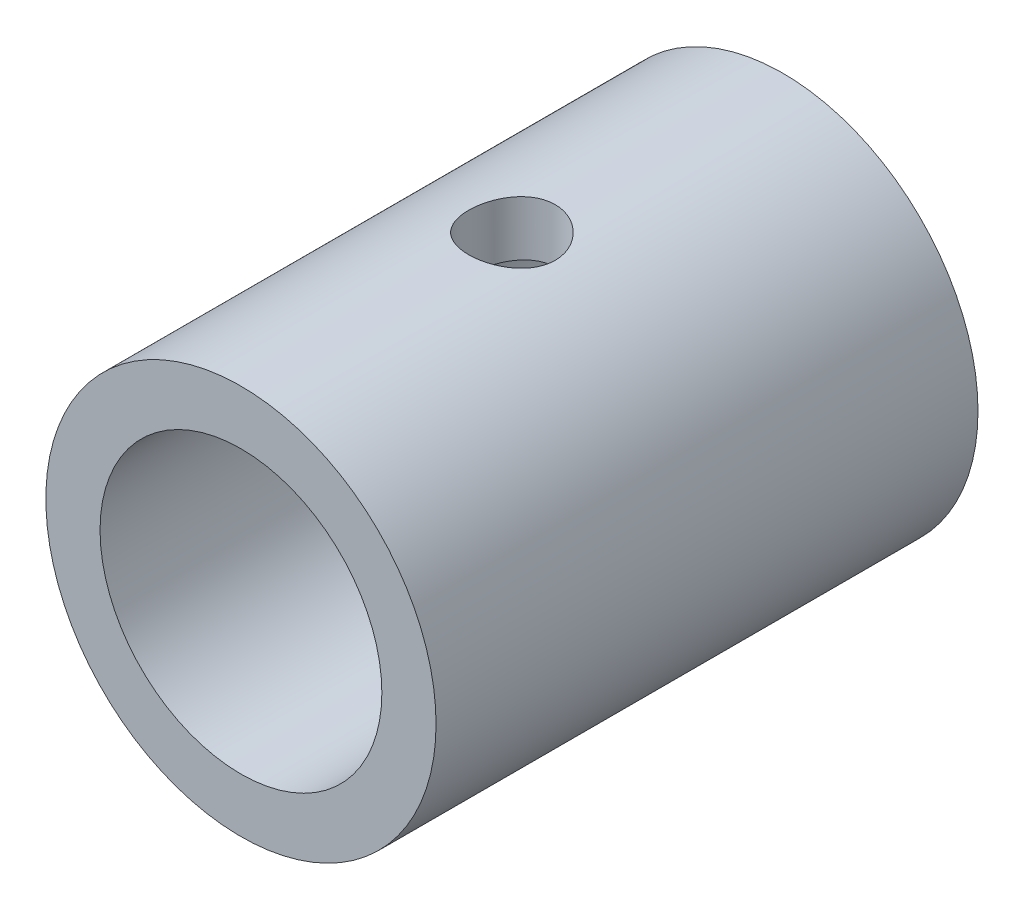
ISO-10303-21;
HEADER;
FILE_DESCRIPTION(('STEP AP214'),'2;1');
FILE_NAME('part.step','',(''),(''),'','','');
FILE_SCHEMA(('AUTOMOTIVE_DESIGN { 1 0 10303 214 1 1 1 1 }'));
ENDSEC;
DATA;
#1=APPLICATION_CONTEXT('core data for automotive mechanical design processes');
#2=APPLICATION_PROTOCOL_DEFINITION('international standard','automotive_design',2000,#1);
#3=PRODUCT_CONTEXT('',#1,'mechanical');
#4=PRODUCT('Part','Part','',(#3));
#5=PRODUCT_RELATED_PRODUCT_CATEGORY('part','',(#4));
#6=PRODUCT_DEFINITION_FORMATION('','',#4);
#7=PRODUCT_DEFINITION_CONTEXT('part definition',#1,'design');
#8=PRODUCT_DEFINITION('design','',#6,#7);
#9=PRODUCT_DEFINITION_SHAPE('','',#8);
#10=(LENGTH_UNIT() NAMED_UNIT(*) SI_UNIT(.MILLI.,.METRE.));
#11=(NAMED_UNIT(*) PLANE_ANGLE_UNIT() SI_UNIT($,.RADIAN.));
#12=(NAMED_UNIT(*) SI_UNIT($,.STERADIAN.) SOLID_ANGLE_UNIT());
#13=UNCERTAINTY_MEASURE_WITH_UNIT(LENGTH_MEASURE(1.E-05),#10,'distance_accuracy_value','');
#14=(GEOMETRIC_REPRESENTATION_CONTEXT(3) GLOBAL_UNCERTAINTY_ASSIGNED_CONTEXT((#13)) GLOBAL_UNIT_ASSIGNED_CONTEXT((#10,
#11,#12)) REPRESENTATION_CONTEXT('',''));
#15=CARTESIAN_POINT('',(0.,0.,0.));
#16=DIRECTION('',(0.,0.,1.));
#17=DIRECTION('',(1.,0.,0.));
#18=AXIS2_PLACEMENT_3D('',#15,#16,#17);
#19=CARTESIAN_POINT('',(0.,0.,12.5));
#20=DIRECTION('',(0.,0.,-1.));
#21=DIRECTION('',(-1.,0.,0.));
#22=AXIS2_PLACEMENT_3D('',#19,#20,#21);
#23=CYLINDRICAL_SURFACE('',#22,6.5);
#24=CARTESIAN_POINT('',(0.,0.,-12.5));
#25=DIRECTION('',(0.,0.,1.));
#26=DIRECTION('',(1.,0.,0.));
#27=AXIS2_PLACEMENT_3D('',#24,#25,#26);
#28=CIRCLE('',#27,6.5);
#29=CARTESIAN_POINT('',(6.5,0.,-12.5));
#30=VERTEX_POINT('',#29);
#31=EDGE_CURVE('E60',#30,#30,#28,.T.);
#32=ORIENTED_EDGE('',*,*,#31,.F.);
#33=EDGE_LOOP('',(#32));
#34=FACE_BOUND('',#33,.T.);
#35=CARTESIAN_POINT('',(0.,0.,12.5));
#36=DIRECTION('',(0.,0.,1.));
#37=DIRECTION('',(1.,0.,0.));
#38=AXIS2_PLACEMENT_3D('',#35,#36,#37);
#39=CIRCLE('',#38,6.5);
#40=CARTESIAN_POINT('',(6.5,0.,12.5));
#41=VERTEX_POINT('',#40);
#42=EDGE_CURVE('E51',#41,#41,#39,.T.);
#43=ORIENTED_EDGE('',*,*,#42,.T.);
#44=EDGE_LOOP('',(#43));
#45=FACE_BOUND('',#44,.T.);
#46=CARTESIAN_POINT('',(0.,6.5,-2.));
#47=CARTESIAN_POINT('',(-0.10958647155408,6.49999929187436,-1.99999903907904));
#48=CARTESIAN_POINT('',(-0.219182761349475,6.49720235792931,-1.99096335239673));
#49=CARTESIAN_POINT('',(-0.435175528984373,6.48631855265072,-1.95515058806477));
#50=CARTESIAN_POINT('',(-0.541571186300281,6.47823033671536,-1.92836900086749));
#51=CARTESIAN_POINT('',(-0.748016546984701,6.45764858487676,-1.85804929310721));
#52=CARTESIAN_POINT('',(-0.848075627090343,6.44516174661238,-1.81453663922322));
#53=CARTESIAN_POINT('',(-1.03947745536717,6.41707535917941,-1.71209679263276));
#54=CARTESIAN_POINT('',(-1.13081890919355,6.40147534884382,-1.65316731576617));
#55=CARTESIAN_POINT('',(-1.30493699247679,6.36829752406617,-1.51970232456005));
#56=CARTESIAN_POINT('',(-1.38741488565838,6.35067760587489,-1.44478758075688));
#57=CARTESIAN_POINT('',(-1.53885708269872,6.31569252815343,-1.28228637649204));
#58=CARTESIAN_POINT('',(-1.60781896662595,6.29832741475793,-1.19469765172807));
#59=CARTESIAN_POINT('',(-1.73187276184925,6.2653687784566,-1.00677139557264));
#60=CARTESIAN_POINT('',(-1.78659481361997,6.24982736044083,-0.906179710702226));
#61=CARTESIAN_POINT('',(-1.8782224418158,6.22290748386974,-0.696666036262746));
#62=CARTESIAN_POINT('',(-1.91513254914664,6.21152796681115,-0.58774617334561));
#63=CARTESIAN_POINT('',(-1.96900160513188,6.19466009001292,-0.36803269394755));
#64=CARTESIAN_POINT('',(-1.9865133955599,6.18900890037713,-0.257387466392708));
#65=CARTESIAN_POINT('',(-2.00281555895419,6.1837537050085,-0.0345962594275914));
#66=CARTESIAN_POINT('',(-2.00161073572821,6.18414814760279,0.077549327517495));
#67=CARTESIAN_POINT('',(-1.98094698228321,6.19079569362891,0.2956150705989));
#68=CARTESIAN_POINT('',(-1.96218684702854,6.19682450731138,0.401609425322224));
#69=CARTESIAN_POINT('',(-1.90807645250928,6.21369772255051,0.608866696596906));
#70=CARTESIAN_POINT('',(-1.87272447914839,6.22454262164885,0.710129123105842));
#71=CARTESIAN_POINT('',(-1.785932217008,6.25000070721951,0.906730047845012));
#72=CARTESIAN_POINT('',(-1.73426970827151,6.2646654217354,1.00196348562844));
#73=CARTESIAN_POINT('',(-1.61647725848254,6.29608673576222,1.18264054437169));
#74=CARTESIAN_POINT('',(-1.55034365635742,6.31284386417593,1.26808167960593));
#75=CARTESIAN_POINT('',(-1.40204114131455,6.34746551983527,1.43070438833206));
#76=CARTESIAN_POINT('',(-1.31929416295853,6.36534631113152,1.50735628256663));
#77=CARTESIAN_POINT('',(-1.14189770882472,6.39954830533242,1.64582220434313));
#78=CARTESIAN_POINT('',(-1.04724740490765,6.4158693995865,1.7076351986405));
#79=CARTESIAN_POINT('',(-0.847732923697558,6.44527556867774,1.8150129771275));
#80=CARTESIAN_POINT('',(-0.742798718966909,6.45833594999018,1.86045486403883));
#81=CARTESIAN_POINT('',(-0.526280934909782,6.47957102319473,1.93288625395853));
#82=CARTESIAN_POINT('',(-0.414699321015766,6.48774715140185,1.95988118201066));
#83=CARTESIAN_POINT('',(-0.192552832432243,6.49806290071844,1.99375804657509));
#84=CARTESIAN_POINT('',(-0.0821071867281238,6.50041772114305,2.0013573525657));
#85=CARTESIAN_POINT('',(0.138491178007733,6.49946000316609,1.99824523351199));
#86=CARTESIAN_POINT('',(0.248643936188298,6.49614826472318,1.98753639306293));
#87=CARTESIAN_POINT('',(0.46278580145148,6.48437074848215,1.94868951788977));
#88=CARTESIAN_POINT('',(0.566859358780056,6.47603039774079,1.92097535283384));
#89=CARTESIAN_POINT('',(0.768852811369361,6.45516726536364,1.8494189235729));
#90=CARTESIAN_POINT('',(0.866771952253669,6.44264397218779,1.80557468672391));
#91=CARTESIAN_POINT('',(1.05627961444668,6.41433382910965,1.70182880519005));
#92=CARTESIAN_POINT('',(1.14766081519562,6.39847611273322,1.64156832323482));
#93=CARTESIAN_POINT('',(1.31925606832413,6.36531333623025,1.50713316991917));
#94=CARTESIAN_POINT('',(1.39946717074091,6.34800789569184,1.43295483502397));
#95=CARTESIAN_POINT('',(1.54963528009096,6.31306645909658,1.26941670055103));
#96=CARTESIAN_POINT('',(1.61908131008095,6.29544322340724,1.17958392405072));
#97=CARTESIAN_POINT('',(1.74195487773042,6.26255963317191,0.989156665398131));
#98=CARTESIAN_POINT('',(1.79538273895787,6.24729923089955,0.888562400684256));
#99=CARTESIAN_POINT('',(1.88435707765313,6.22104126828921,0.679721743070963));
#100=CARTESIAN_POINT('',(1.9199786710239,6.21002584634022,0.571509730226962));
#101=CARTESIAN_POINT('',(1.97237526121825,6.19358575896332,0.350217384273935));
#102=CARTESIAN_POINT('',(1.98915714872108,6.18815904950702,0.237138846833982));
#103=CARTESIAN_POINT('',(2.00291323790433,6.18371932373484,0.0146519278920736));
#104=CARTESIAN_POINT('',(2.00072360720728,6.18443554393433,-0.094700004551062));
#105=CARTESIAN_POINT('',(1.97860856561739,6.19154584982148,-0.311397838847259));
#106=CARTESIAN_POINT('',(1.95868393542585,6.19793968557834,-0.418743828790289));
#107=CARTESIAN_POINT('',(1.90221657867545,6.21549850608435,-0.626937428537499));
#108=CARTESIAN_POINT('',(1.8659061649831,6.22659666514378,-0.727854105684839));
#109=CARTESIAN_POINT('',(1.77788001247773,6.25229841004041,-0.92224355662551));
#110=CARTESIAN_POINT('',(1.72616121006624,6.26690269287625,-1.01571484538877));
#111=CARTESIAN_POINT('',(1.60648172875982,6.29866516433667,-1.19641250748051));
#112=CARTESIAN_POINT('',(1.5379775201733,6.31589943241281,-1.28326549413256));
#113=CARTESIAN_POINT('',(1.38763671757875,6.35062263668655,-1.44451406697947));
#114=CARTESIAN_POINT('',(1.30579660000223,6.36811163907406,-1.51890635028652));
#115=CARTESIAN_POINT('',(1.12802317077525,6.40203042414332,-1.65544917959683));
#116=CARTESIAN_POINT('',(1.0317288656853,6.41840990638034,-1.71714357533484));
#117=CARTESIAN_POINT('',(0.829631192009797,6.44764383058531,-1.82338445665249));
#118=CARTESIAN_POINT('',(0.7238318640324,6.46049976109691,-1.86793818662102));
#119=CARTESIAN_POINT('',(0.515929652571417,6.48025348346413,-1.93510071206019));
#120=CARTESIAN_POINT('',(0.414403258515525,6.48759534805451,-1.95936947108914));
#121=CARTESIAN_POINT('',(0.208587191828517,6.4974684909107,-1.99181805932323));
#122=CARTESIAN_POINT('',(0.104298042658334,6.50000067395288,-2.00000091454879));
#123=CARTESIAN_POINT('',(0.,6.5,-2.));
#124=B_SPLINE_CURVE_WITH_KNOTS('',3,(#46,#47,#48,#49,#50,#51,#52,#53,#54,#55,#56,#57,#58,#59,
#60,#61,#62,#63,#64,#65,#66,#67,#68,#69,#70,#71,#72,#73,#74,#75,#76,#77,#78,#79,#80,#81,#82,#83,
#84,#85,#86,#87,#88,#89,#90,#91,#92,#93,#94,#95,#96,#97,#98,#99,#100,#101,#102,#103,#104,#105,
#106,#107,#108,#109,#110,#111,#112,#113,#114,#115,#116,#117,#118,#119,#120,#121,#122,#123),
.UNSPECIFIED.,.T.,.F.,(4,2,2,2,2,2,2,2,2,2,2,2,2,2,2,2,2,2,2,2,2,2,2,2,2,2,2,2,2,2,2,2,2,2,2,2,
2,2,4),(0.,0.328376148353204,0.656835774920463,0.984797413319644,1.31280767013794,
1.64969601962051,1.98664463123191,2.33162619975385,2.67651996741947,3.0113091274622,
3.34601236190892,3.66793485951994,3.98989062214147,4.31643724588171,4.64306657905952,
4.98408507994297,5.32512731933627,5.66867887562647,6.01212935372403,6.34267966649236,
6.67318331870836,6.99576592200042,7.31838798898982,7.6487232534981,7.97914559299321,
8.322234878021,8.66531723215741,9.00693981167225,9.34843740094787,9.67496275718919,
10.0014737403731,10.3234943027839,10.6455789342452,10.9799294848454,11.3143685200785,
11.6592775258489,12.0040405975475,12.3166287634493,12.6291581207982),.UNSPECIFIED.);
#125=CARTESIAN_POINT('',(0.,6.5,-2.));
#126=VERTEX_POINT('',#125);
#127=EDGE_CURVE('E62',#126,#126,#124,.T.);
#128=ORIENTED_EDGE('',*,*,#127,.T.);
#129=EDGE_LOOP('',(#128));
#130=FACE_BOUND('',#129,.T.);
#131=ADVANCED_FACE('F36',(#34,#45,#130),#23,.F.);
#132=CARTESIAN_POINT('',(0.,0.,12.5));
#133=DIRECTION('',(0.,0.,-1.));
#134=DIRECTION('',(-1.,0.,0.));
#135=AXIS2_PLACEMENT_3D('',#132,#133,#134);
#136=CYLINDRICAL_SURFACE('',#135,9.);
#137=CARTESIAN_POINT('',(0.,0.,12.5));
#138=DIRECTION('',(0.,0.,1.));
#139=DIRECTION('',(1.,0.,0.));
#140=AXIS2_PLACEMENT_3D('',#137,#138,#139);
#141=CIRCLE('',#140,9.);
#142=CARTESIAN_POINT('',(9.,0.,12.5));
#143=VERTEX_POINT('',#142);
#144=EDGE_CURVE('E47',#143,#143,#141,.T.);
#145=ORIENTED_EDGE('',*,*,#144,.F.);
#146=EDGE_LOOP('',(#145));
#147=FACE_BOUND('',#146,.T.);
#148=CARTESIAN_POINT('',(0.,0.,-12.5));
#149=DIRECTION('',(0.,0.,1.));
#150=DIRECTION('',(1.,0.,0.));
#151=AXIS2_PLACEMENT_3D('',#148,#149,#150);
#152=CIRCLE('',#151,9.);
#153=CARTESIAN_POINT('',(9.,0.,-12.5));
#154=VERTEX_POINT('',#153);
#155=EDGE_CURVE('E56',#154,#154,#152,.T.);
#156=ORIENTED_EDGE('',*,*,#155,.T.);
#157=EDGE_LOOP('',(#156));
#158=FACE_BOUND('',#157,.T.);
#159=CARTESIAN_POINT('',(0.,9.,-2.));
#160=CARTESIAN_POINT('',(-0.110880476775648,8.99999796218252,-1.99999627632018));
#161=CARTESIAN_POINT('',(-0.22180556526962,8.99793013995692,-1.99074801833651));
#162=CARTESIAN_POINT('',(-0.440501944103134,8.98988097757669,-1.95403952764944));
#163=CARTESIAN_POINT('',(-0.548270975138988,8.98389690217348,-1.92656656599072));
#164=CARTESIAN_POINT('',(-0.757463277761528,8.96868113169008,-1.85431402950835));
#165=CARTESIAN_POINT('',(-0.858893152100284,8.95945288439082,-1.80955282300213));
#166=CARTESIAN_POINT('',(-1.05280018031376,8.93874335441377,-1.70405338752759));
#167=CARTESIAN_POINT('',(-1.14527750793335,8.92726211547358,-1.64331546870938));
#168=CARTESIAN_POINT('',(-1.32018631401403,8.9030909417421,-1.50652433489332));
#169=CARTESIAN_POINT('',(-1.40244861204353,8.89038561641427,-1.43025749786486));
#170=CARTESIAN_POINT('',(-1.55312491045837,8.86530601079787,-1.26503193990686));
#171=CARTESIAN_POINT('',(-1.62153764410855,8.85293176088049,-1.17607205928954));
#172=CARTESIAN_POINT('',(-1.74332443410351,8.82976328261711,-0.986728155941699));
#173=CARTESIAN_POINT('',(-1.79651742104404,8.81898875742981,-0.886225041958468));
#174=CARTESIAN_POINT('',(-1.88519298954508,8.80046096352395,-0.677427238307577));
#175=CARTESIAN_POINT('',(-1.92067776220096,8.79270732104771,-0.569133514495745));
#176=CARTESIAN_POINT('',(-1.97236858006404,8.78125609459189,-0.349666522677333));
#177=CARTESIAN_POINT('',(-1.98887467038069,8.77749545807783,-0.238567284894572));
#178=CARTESIAN_POINT('',(-2.00307270997673,8.77426673730669,-0.0151177822137985));
#179=CARTESIAN_POINT('',(-2.00076704911663,8.77479810778939,0.0972323219621485));
#180=CARTESIAN_POINT('',(-1.97764827517302,8.78003632148145,0.317756627193804));
#181=CARTESIAN_POINT('',(-1.95718464460217,8.78466431384841,0.425969624139347));
#182=CARTESIAN_POINT('',(-1.89888490681146,8.79744954191675,0.637387143325004));
#183=CARTESIAN_POINT('',(-1.86104779681651,8.80560698133176,0.740591376085401));
#184=CARTESIAN_POINT('',(-1.76875672872875,8.82460909970296,0.940039438381883));
#185=CARTESIAN_POINT('',(-1.71416919379353,8.83547524362489,1.03621932733607));
#186=CARTESIAN_POINT('',(-1.5900206813985,8.85865737910743,1.21818287051589));
#187=CARTESIAN_POINT('',(-1.52045760074274,8.87097357420597,1.30396506182015));
#188=CARTESIAN_POINT('',(-1.36648683702983,8.89600574612666,1.46470930934847));
#189=CARTESIAN_POINT('',(-1.28178220526623,8.90872450687872,1.53938678510506));
#190=CARTESIAN_POINT('',(-1.10090661809162,8.93287839122317,1.67352372890712));
#191=CARTESIAN_POINT('',(-1.00473544183737,8.94431349008427,1.7329829037819));
#192=CARTESIAN_POINT('',(-0.803303190734734,8.96465064233607,1.83506927577681));
#193=CARTESIAN_POINT('',(-0.698022122319853,8.97354693007659,1.87765824430826));
#194=CARTESIAN_POINT('',(-0.481555930981455,8.98776136366255,1.94446101305787));
#195=CARTESIAN_POINT('',(-0.370371697593364,8.99308004696785,1.96867757341413));
#196=CARTESIAN_POINT('',(-0.147695483280844,8.99946317761672,1.99763201325517));
#197=CARTESIAN_POINT('',(-0.0362563973189039,9.0006124862229,2.00275850016168));
#198=CARTESIAN_POINT('',(0.185885923928081,8.99876558650597,1.99444189573963));
#199=CARTESIAN_POINT('',(0.296589210270647,8.9957696689046,1.98100010668055));
#200=CARTESIAN_POINT('',(0.512823257329423,8.98602258758613,1.9362505848319));
#201=CARTESIAN_POINT('',(0.618398491715485,8.97931447007761,1.90514754377655));
#202=CARTESIAN_POINT('',(0.822832805855833,8.96289421086795,1.82618631255492));
#203=CARTESIAN_POINT('',(0.921691300010179,8.95318180764659,1.77832666369399));
#204=CARTESIAN_POINT('',(1.11148643989438,8.93162153227639,1.66640712320101));
#205=CARTESIAN_POINT('',(1.20228573083225,8.91974444590247,1.60212005699384));
#206=CARTESIAN_POINT('',(1.37194696498812,8.8952303234908,1.45946875089856));
#207=CARTESIAN_POINT('',(1.45080730173413,8.88259318550175,1.3811026196679));
#208=CARTESIAN_POINT('',(1.59589548190985,8.8576887894581,1.2107319664193));
#209=CARTESIAN_POINT('',(1.66185381940073,8.84543317664284,1.1184959099934));
#210=CARTESIAN_POINT('',(1.77734611922752,8.82295395378308,0.924027965589184));
#211=CARTESIAN_POINT('',(1.82688079926974,8.8127302549527,0.821796514657903));
#212=CARTESIAN_POINT('',(1.90778001896259,8.79557200548926,0.610791710894863));
#213=CARTESIAN_POINT('',(1.93924786354759,8.78861879659786,0.502059557731161));
#214=CARTESIAN_POINT('',(1.98342027658406,8.77875649697392,0.280675815137526));
#215=CARTESIAN_POINT('',(1.99612795718356,8.77584673547331,0.168024878974045));
#216=CARTESIAN_POINT('',(2.00228356641044,8.77444401448977,-0.0552788782783299));
#217=CARTESIAN_POINT('',(1.99615913143933,8.77585298370124,-0.165919508060062));
#218=CARTESIAN_POINT('',(1.96578277121688,8.78270664957547,-0.384549709966821));
#219=CARTESIAN_POINT('',(1.94153107400239,8.78815129547033,-0.492539315423485));
#220=CARTESIAN_POINT('',(1.87579819980744,8.80241428131525,-0.70244912022738));
#221=CARTESIAN_POINT('',(1.83438116628453,8.81122005182769,-0.804390316881596));
#222=CARTESIAN_POINT('',(1.73554770348342,8.83121764469057,-0.999939992546728));
#223=CARTESIAN_POINT('',(1.67812954585193,8.84240972476633,-1.09354756996401));
#224=CARTESIAN_POINT('',(1.54751358990558,8.86621042835329,-1.27187660894797));
#225=CARTESIAN_POINT('',(1.47401185511038,8.8788437136774,-1.35637220492265));
#226=CARTESIAN_POINT('',(1.31392870594504,8.90393974173387,-1.51197007393133));
#227=CARTESIAN_POINT('',(1.22734426623343,8.91640244429053,-1.58306924050841));
#228=CARTESIAN_POINT('',(1.04214597064556,8.93995259726581,-1.71077598291992));
#229=CARTESIAN_POINT('',(0.943385636634947,8.95101923499228,-1.76717519973493));
#230=CARTESIAN_POINT('',(0.737560279778817,8.97032058369249,-1.86248330418121));
#231=CARTESIAN_POINT('',(0.630502203312994,8.97855763270815,-1.90140664004617));
#232=CARTESIAN_POINT('',(0.436138247729408,8.98982812909554,-1.95384135027679));
#233=CARTESIAN_POINT('',(0.34987199190168,8.9936186902321,-1.97111737366629));
#234=CARTESIAN_POINT('',(0.175746449894527,8.99870537459789,-1.99419790430615));
#235=CARTESIAN_POINT('',(0.0878872388928776,9.00000161523612,-2.0000029515019));
#236=CARTESIAN_POINT('',(0.,9.,-2.));
#237=B_SPLINE_CURVE_WITH_KNOTS('',3,(#159,#160,#161,#162,#163,#164,#165,#166,#167,#168,#169,
#170,#171,#172,#173,#174,#175,#176,#177,#178,#179,#180,#181,#182,#183,#184,#185,#186,#187,#188,
#189,#190,#191,#192,#193,#194,#195,#196,#197,#198,#199,#200,#201,#202,#203,#204,#205,#206,#207,
#208,#209,#210,#211,#212,#213,#214,#215,#216,#217,#218,#219,#220,#221,#222,#223,#224,#225,#226,
#227,#228,#229,#230,#231,#232,#233,#234,#235,#236),.UNSPECIFIED.,.T.,.F.,(4,2,2,2,2,2,2,2,2,2,2,
2,2,2,2,2,2,2,2,2,2,2,2,2,2,2,2,2,2,2,2,2,2,2,2,2,2,2,4),(0.,0.332319689729797,
0.664871731249283,0.997071412407458,1.32926464516989,1.66638072002079,2.00352761490514,
2.34453296297976,2.6854961068774,3.02099125638107,3.35644378496591,3.68557668145784,
4.0147285774694,4.34657669709581,4.678471452583,5.01778179808977,5.35709867969827,
5.69718012811237,6.03721047501988,6.37027992124269,6.70332600912267,7.03258869425167,
7.36188004945459,7.69599803262041,8.03016093387756,8.37069473105728,8.71121364510411,
9.04976559055243,9.38826136686411,9.71912785142416,10.0499901738286,10.3796271201578,
10.7092996858639,11.0458432631282,11.3824647846641,11.7236258704957,12.0645043787094,
12.3279234735856,12.5913301688795),.UNSPECIFIED.);
#238=CARTESIAN_POINT('',(0.,9.,-2.));
#239=VERTEX_POINT('',#238);
#240=EDGE_CURVE('E10',#239,#239,#237,.T.);
#241=ORIENTED_EDGE('',*,*,#240,.F.);
#242=EDGE_LOOP('',(#241));
#243=FACE_BOUND('',#242,.T.);
#244=ADVANCED_FACE('F66',(#147,#158,#243),#136,.T.);
#245=CARTESIAN_POINT('',(0.,0.,12.5));
#246=DIRECTION('',(0.,0.,1.));
#247=DIRECTION('',(1.,0.,0.));
#248=AXIS2_PLACEMENT_3D('',#245,#246,#247);
#249=PLANE('',#248);
#250=ORIENTED_EDGE('',*,*,#42,.F.);
#251=EDGE_LOOP('',(#250));
#252=FACE_BOUND('',#251,.T.);
#253=ORIENTED_EDGE('',*,*,#144,.T.);
#254=EDGE_LOOP('',(#253));
#255=FACE_BOUND('',#254,.T.);
#256=ADVANCED_FACE('F72',(#252,#255),#249,.T.);
#257=CARTESIAN_POINT('',(0.,0.,-12.5));
#258=DIRECTION('',(0.,0.,1.));
#259=DIRECTION('',(1.,0.,0.));
#260=AXIS2_PLACEMENT_3D('',#257,#258,#259);
#261=PLANE('',#260);
#262=ORIENTED_EDGE('',*,*,#31,.T.);
#263=EDGE_LOOP('',(#262));
#264=FACE_BOUND('',#263,.T.);
#265=ORIENTED_EDGE('',*,*,#155,.F.);
#266=EDGE_LOOP('',(#265));
#267=FACE_BOUND('',#266,.T.);
#268=ADVANCED_FACE('F69',(#264,#267),#261,.F.);
#269=CARTESIAN_POINT('',(0.,9.,0.));
#270=DIRECTION('',(0.,-1.,0.));
#271=DIRECTION('',(0.,0.,-1.));
#272=AXIS2_PLACEMENT_3D('',#269,#270,#271);
#273=CYLINDRICAL_SURFACE('',#272,2.);
#274=ORIENTED_EDGE('',*,*,#127,.F.);
#275=EDGE_LOOP('',(#274));
#276=FACE_BOUND('',#275,.T.);
#277=ORIENTED_EDGE('',*,*,#240,.T.);
#278=EDGE_LOOP('',(#277));
#279=FACE_BOUND('',#278,.T.);
#280=ADVANCED_FACE('F71',(#276,#279),#273,.F.);
#281=CLOSED_SHELL('',(#131,#244,#256,#268,#280));
#282=MANIFOLD_SOLID_BREP('B2',#281);
#283=ADVANCED_BREP_SHAPE_REPRESENTATION('',(#18,#282),#14);
#284=SHAPE_DEFINITION_REPRESENTATION(#9,#283);
ENDSEC;
END-ISO-10303-21;
